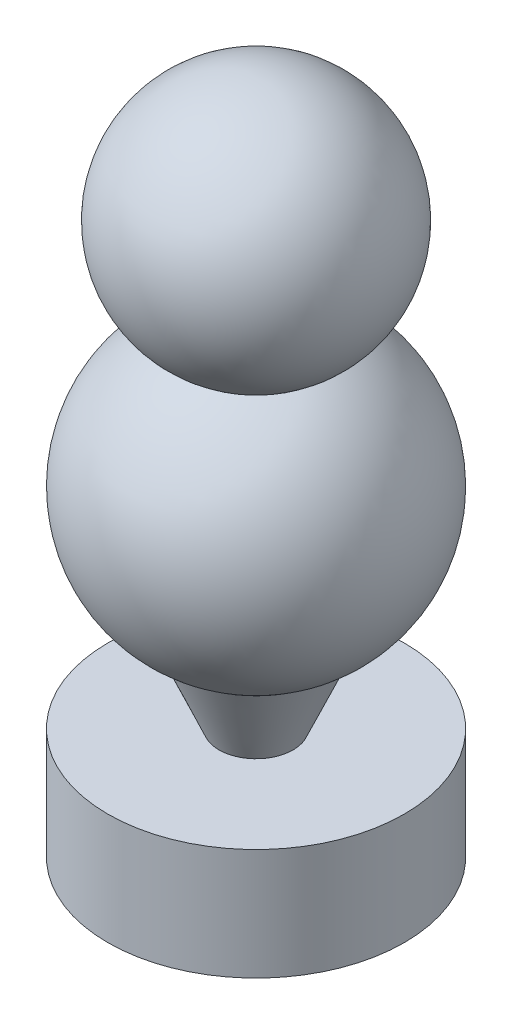
ISO-10303-21;
HEADER;
FILE_DESCRIPTION(('STEP AP214'),'2;1');
FILE_NAME('part.step','',(''),(''),'','','');
FILE_SCHEMA(('AUTOMOTIVE_DESIGN { 1 0 10303 214 1 1 1 1 }'));
ENDSEC;
DATA;
#1=APPLICATION_CONTEXT('core data for automotive mechanical design processes');
#2=APPLICATION_PROTOCOL_DEFINITION('international standard','automotive_design',2000,#1);
#3=PRODUCT_CONTEXT('',#1,'mechanical');
#4=PRODUCT('Part','Part','',(#3));
#5=PRODUCT_RELATED_PRODUCT_CATEGORY('part','',(#4));
#6=PRODUCT_DEFINITION_FORMATION('','',#4);
#7=PRODUCT_DEFINITION_CONTEXT('part definition',#1,'design');
#8=PRODUCT_DEFINITION('design','',#6,#7);
#9=PRODUCT_DEFINITION_SHAPE('','',#8);
#10=(LENGTH_UNIT() NAMED_UNIT(*) SI_UNIT(.MILLI.,.METRE.));
#11=(NAMED_UNIT(*) PLANE_ANGLE_UNIT() SI_UNIT($,.RADIAN.));
#12=(NAMED_UNIT(*) SI_UNIT($,.STERADIAN.) SOLID_ANGLE_UNIT());
#13=UNCERTAINTY_MEASURE_WITH_UNIT(LENGTH_MEASURE(1.E-05),#10,'distance_accuracy_value','');
#14=(GEOMETRIC_REPRESENTATION_CONTEXT(3) GLOBAL_UNCERTAINTY_ASSIGNED_CONTEXT((#13)) GLOBAL_UNIT_ASSIGNED_CONTEXT((#10,
#11,#12)) REPRESENTATION_CONTEXT('',''));
#15=CARTESIAN_POINT('',(0.,0.,0.));
#16=DIRECTION('',(0.,0.,1.));
#17=DIRECTION('',(1.,0.,0.));
#18=AXIS2_PLACEMENT_3D('',#15,#16,#17);
#19=CARTESIAN_POINT('',(0.,0.,0.));
#20=DIRECTION('',(0.,1.,0.));
#21=DIRECTION('',(1.,0.,0.));
#22=AXIS2_PLACEMENT_3D('',#19,#20,#21);
#23=SPHERICAL_SURFACE('',#22,10.0000000000001);
#24=CARTESIAN_POINT('',(0.,-8.13423948235809,0.));
#25=DIRECTION('',(0.,1.,0.));
#26=DIRECTION('',(0.,0.,1.));
#27=AXIS2_PLACEMENT_3D('',#24,#25,#26);
#28=CIRCLE('',#27,5.81671282114294);
#29=CARTESIAN_POINT('',(5.81671282114295,-8.13423948235809,0.));
#30=VERTEX_POINT('',#29);
#31=EDGE_CURVE('E72',#30,#30,#28,.T.);
#32=ORIENTED_EDGE('',*,*,#31,.T.);
#33=EDGE_LOOP('',(#32));
#34=FACE_BOUND('',#33,.T.);
#35=ADVANCED_FACE('F49',(#34),#23,.T.);
#36=CARTESIAN_POINT('',(0.,-44.630231667776,0.));
#37=DIRECTION('',(0.,1.,0.));
#38=DIRECTION('',(0.,0.,1.));
#39=AXIS2_PLACEMENT_3D('',#36,#37,#38);
#40=PLANE('',#39);
#41=CARTESIAN_POINT('',(0.,-44.630231667776,0.));
#42=DIRECTION('',(0.,1.,0.));
#43=DIRECTION('',(0.,0.,1.));
#44=AXIS2_PLACEMENT_3D('',#41,#42,#43);
#45=CIRCLE('',#44,12.);
#46=CARTESIAN_POINT('',(0.,-44.630231667776,12.));
#47=VERTEX_POINT('',#46);
#48=EDGE_CURVE('E10',#47,#47,#45,.T.);
#49=ORIENTED_EDGE('',*,*,#48,.F.);
#50=EDGE_LOOP('',(#49));
#51=FACE_BOUND('',#50,.T.);
#52=ADVANCED_FACE('F99',(#51),#40,.F.);
#53=CARTESIAN_POINT('',(0.,10.0000000000001,0.));
#54=DIRECTION('',(0.,1.,0.));
#55=DIRECTION('',(0.,0.,1.));
#56=AXIS2_PLACEMENT_3D('',#53,#54,#55);
#57=CYLINDRICAL_SURFACE('',#56,12.);
#58=ORIENTED_EDGE('',*,*,#48,.T.);
#59=EDGE_LOOP('',(#58));
#60=FACE_BOUND('',#59,.T.);
#61=CARTESIAN_POINT('',(0.,-35.6164608880505,0.));
#62=DIRECTION('',(0.,1.,0.));
#63=DIRECTION('',(0.,0.,1.));
#64=AXIS2_PLACEMENT_3D('',#61,#62,#63);
#65=CIRCLE('',#64,12.);
#66=CARTESIAN_POINT('',(0.,-35.6164608880505,12.));
#67=VERTEX_POINT('',#66);
#68=EDGE_CURVE('E56',#67,#67,#65,.T.);
#69=ORIENTED_EDGE('',*,*,#68,.F.);
#70=EDGE_LOOP('',(#69));
#71=FACE_BOUND('',#70,.T.);
#72=ADVANCED_FACE('F92',(#60,#71),#57,.T.);
#73=CARTESIAN_POINT('',(0.,-35.6164608880505,0.));
#74=DIRECTION('',(0.,1.,0.));
#75=DIRECTION('',(0.,0.,1.));
#76=AXIS2_PLACEMENT_3D('',#73,#74,#75);
#77=PLANE('',#76);
#78=ORIENTED_EDGE('',*,*,#68,.T.);
#79=EDGE_LOOP('',(#78));
#80=FACE_BOUND('',#79,.T.);
#81=CARTESIAN_POINT('',(0.,-35.6164608880505,0.));
#82=DIRECTION('',(0.,1.,0.));
#83=DIRECTION('',(0.,0.,1.));
#84=AXIS2_PLACEMENT_3D('',#81,#82,#83);
#85=CIRCLE('',#84,3.);
#86=CARTESIAN_POINT('',(0.,-35.6164608880505,3.));
#87=VERTEX_POINT('',#86);
#88=EDGE_CURVE('E61',#87,#87,#85,.T.);
#89=ORIENTED_EDGE('',*,*,#88,.F.);
#90=EDGE_LOOP('',(#89));
#91=FACE_BOUND('',#90,.T.);
#92=ADVANCED_FACE('F87',(#80,#91),#77,.T.);
#93=CARTESIAN_POINT('',(0.,-35.6164608880505,0.));
#94=DIRECTION('',(0.,1.,0.));
#95=DIRECTION('',(0.,0.,1.));
#96=AXIS2_PLACEMENT_3D('',#93,#94,#95);
#97=CONICAL_SURFACE('',#96,3.,0.409462712330232);
#98=CARTESIAN_POINT('',(0.,-29.1262225179342,0.));
#99=DIRECTION('',(0.,1.,0.));
#100=DIRECTION('',(0.,0.,1.));
#101=AXIS2_PLACEMENT_3D('',#98,#99,#100);
#102=CIRCLE('',#101,5.81671523055731);
#103=CARTESIAN_POINT('',(5.81671523055729,-29.1262225179342,0.));
#104=VERTEX_POINT('',#103);
#105=EDGE_CURVE('E66',#104,#104,#102,.T.);
#106=ORIENTED_EDGE('',*,*,#105,.F.);
#107=EDGE_LOOP('',(#106));
#108=FACE_BOUND('',#107,.T.);
#109=ORIENTED_EDGE('',*,*,#88,.T.);
#110=EDGE_LOOP('',(#109));
#111=FACE_BOUND('',#110,.T.);
#112=ADVANCED_FACE('F81',(#108,#111),#97,.T.);
#113=CARTESIAN_POINT('',(0.,-18.630231667776,0.));
#114=DIRECTION('',(0.,1.,0.));
#115=DIRECTION('',(1.,0.,0.));
#116=AXIS2_PLACEMENT_3D('',#113,#114,#115);
#117=SPHERICAL_SURFACE('',#116,12.0000000000001);
#118=CARTESIAN_POINT('',(5.81671282114295,-8.13423948235809,0.));
#119=CARTESIAN_POINT('',(6.04954476871993,-8.26325519613192,0.));
#120=CARTESIAN_POINT('',(6.2780687376204,-8.40004111346909,0.));
#121=CARTESIAN_POINT('',(6.72552257937001,-8.68849586735165,0.));
#122=CARTESIAN_POINT('',(6.94445245221916,-8.84016470389705,0.));
#123=CARTESIAN_POINT('',(7.3717399631678,-9.15772780827763,0.));
#124=CARTESIAN_POINT('',(7.58009760126731,-9.32362207611282,0.));
#125=CARTESIAN_POINT('',(7.98532068557727,-9.66889792813955,0.));
#126=CARTESIAN_POINT('',(8.18218613178772,-9.84827951233109,0.));
#127=CARTESIAN_POINT('',(8.56355269975541,-10.2197369064566,0.));
#128=CARTESIAN_POINT('',(8.74805382151265,-10.4118127163906,0.));
#129=CARTESIAN_POINT('',(9.10387515972482,-10.8078080088475,0.));
#130=CARTESIAN_POINT('',(9.27519537617977,-11.0117274913704,0.));
#131=CARTESIAN_POINT('',(9.60389645352163,-11.4305074856459,0.));
#132=CARTESIAN_POINT('',(9.76127731440855,-11.6453679973984,0.));
#133=CARTESIAN_POINT('',(10.0614029960484,-12.0850788817913,0.));
#134=CARTESIAN_POINT('',(10.2041478168012,-12.3099292544316,0.));
#135=CARTESIAN_POINT('',(10.4743695090242,-12.7686244933116,0.));
#136=CARTESIAN_POINT('',(10.6018463804942,-13.0024693595513,0.));
#137=CARTESIAN_POINT('',(10.8409678576989,-13.4781183947913,0.));
#138=CARTESIAN_POINT('',(10.9526124634335,-13.7199225637917,0.));
#139=CARTESIAN_POINT('',(11.1595751781993,-14.2104197810534,0.));
#140=CARTESIAN_POINT('',(11.2548932872304,-14.4591128293147,0.));
#141=CARTESIAN_POINT('',(11.4287810524081,-14.9622868852913,0.));
#142=CARTESIAN_POINT('',(11.5073507085547,-15.2167678930066,0.));
#143=CARTESIAN_POINT('',(11.6473937541111,-15.730391325947,0.));
#144=CARTESIAN_POINT('',(11.7088671435209,-15.9895337511721,0.));
#145=CARTESIAN_POINT('',(11.8144455238927,-16.5113328418918,0.));
#146=CARTESIAN_POINT('',(11.8585505148547,-16.7739895073862,0.));
#147=CARTESIAN_POINT('',(11.9291968534117,-17.301654344499,0.));
#148=CARTESIAN_POINT('',(11.9557382010067,-17.5666625161173,0.));
#149=CARTESIAN_POINT('',(11.9911397590247,-18.097857221632,0.));
#150=CARTESIAN_POINT('',(11.9999999694477,-18.3640437555285,0.));
#151=CARTESIAN_POINT('',(12.0000000305523,-18.8964168253554,0.));
#152=CARTESIAN_POINT('',(11.991139881234,-19.1626033612858,0.));
#153=CARTESIAN_POINT('',(11.9557384451547,-19.6937980749272,0.));
#154=CARTESIAN_POINT('',(11.9291971583938,-19.9588062526382,0.));
#155=CARTESIAN_POINT('',(11.8585509409653,-20.4864711059682,0.));
#156=CARTESIAN_POINT('',(11.8144460102977,-20.7491277815872,0.));
#157=CARTESIAN_POINT('',(11.7088677497078,-21.2709268965429,0.));
#158=CARTESIAN_POINT('',(11.6473944197856,-21.5300693358796,0.));
#159=CARTESIAN_POINT('',(11.5073514921343,-22.0436928009677,0.));
#160=CARTESIAN_POINT('',(11.4287818944053,-22.2981738267191,0.));
#161=CARTESIAN_POINT('',(11.2548942447341,-22.8013479226126,0.));
#162=CARTESIAN_POINT('',(11.1595761927919,-23.0500409927547,0.));
#163=CARTESIAN_POINT('',(10.9526135906225,-23.5405382575259,0.));
#164=CARTESIAN_POINT('',(10.8409690403954,-23.7823424521549,0.));
#165=CARTESIAN_POINT('',(10.6018476723786,-24.2579915422866,0.));
#166=CARTESIAN_POINT('',(10.474370854589,-24.4918364377893,0.));
#167=CARTESIAN_POINT('',(10.2041492676622,-24.9505317387002,0.));
#168=CARTESIAN_POINT('',(10.061404498525,-25.1753821441084,0.));
#169=CARTESIAN_POINT('',(9.76127891782333,-25.6150930973968,0.));
#170=CARTESIAN_POINT('',(9.60389810625887,-25.829953645277,0.));
#171=CARTESIAN_POINT('',(9.27519712505033,-26.2487337150077,0.));
#172=CARTESIAN_POINT('',(9.10387695540627,-26.4526532368581,0.));
#173=CARTESIAN_POINT('',(8.74805570809706,-26.8486486109958,0.));
#174=CARTESIAN_POINT('',(8.56355463043192,-27.0407244632831,0.));
#175=CARTESIAN_POINT('',(8.18218814773439,-27.4121819449534,0.));
#176=CARTESIAN_POINT('',(7.98532274270201,-27.5915635743365,0.));
#177=CARTESIAN_POINT('',(7.58009973765208,-27.9368395193845,0.));
#178=CARTESIAN_POINT('',(7.37174213763455,-28.1027338350494,0.));
#179=CARTESIAN_POINT('',(6.94445469958433,-28.4202970375162,0.));
#180=CARTESIAN_POINT('',(6.72552486155163,-28.5719659243182,0.));
#181=CARTESIAN_POINT('',(6.27807108601846,-28.8604207809163,0.));
#182=CARTESIAN_POINT('',(6.04954714851798,-28.9972067507125,0.));
#183=CARTESIAN_POINT('',(5.81671523055729,-29.1262225179342,0.));
#184=B_SPLINE_CURVE_WITH_KNOTS('',3,(#118,#119,#120,#121,#122,#123,#124,#125,#126,#127,#128,
#129,#130,#131,#132,#133,#134,#135,#136,#137,#138,#139,#140,#141,#142,#143,#144,#145,#146,#147,
#148,#149,#150,#151,#152,#153,#154,#155,#156,#157,#158,#159,#160,#161,#162,#163,#164,#165,#166,
#167,#168,#169,#170,#171,#172,#173,#174,#175,#176,#177,#178,#179,#180,#181,#182,#183),
.UNSPECIFIED.,.F.,.F.,(4,2,2,2,2,2,2,2,2,2,2,2,2,2,2,2,2,2,2,2,2,2,2,2,2,2,2,2,2,2,2,2,4),(0.,
0.79841235053007,1.59682470106014,2.39523705159021,3.19364940212028,3.99206175265035,
4.79047410318042,5.5888864537105,6.38729880424056,7.18571115477064,7.98412350530071,
8.78253585583078,9.58094820636085,10.3793605568909,11.177772907421,11.9761852579511,
12.7745976084811,13.5730099590112,14.3714223095413,15.1698346600713,15.9682470106014,
16.7666593611315,17.5650717116616,18.3634840621916,19.1618964127217,19.9603087632518,
20.7587211137818,21.5571334643119,22.355545814842,23.1539581653721,23.9523705159021,
24.7507828664322,25.5491952169623),.UNSPECIFIED.);
#185=EDGE_CURVE('BSEAM78',#30,#104,#184,.T.);
#186=ORIENTED_EDGE('',*,*,#31,.F.);
#187=ORIENTED_EDGE('',*,*,#105,.T.);
#188=ORIENTED_EDGE('',*,*,#185,.T.);
#189=ORIENTED_EDGE('',*,*,#185,.F.);
#190=EDGE_LOOP('',(#186,#188,#187,#189));
#191=FACE_BOUND('',#190,.T.);
#192=ADVANCED_FACE('F78',(#191),#117,.T.);
#193=CLOSED_SHELL('',(#35,#52,#72,#92,#112,#192));
#194=MANIFOLD_SOLID_BREP('B2',#193);
#195=ADVANCED_BREP_SHAPE_REPRESENTATION('',(#18,#194),#14);
#196=SHAPE_DEFINITION_REPRESENTATION(#9,#195);
ENDSEC;
END-ISO-10303-21;
